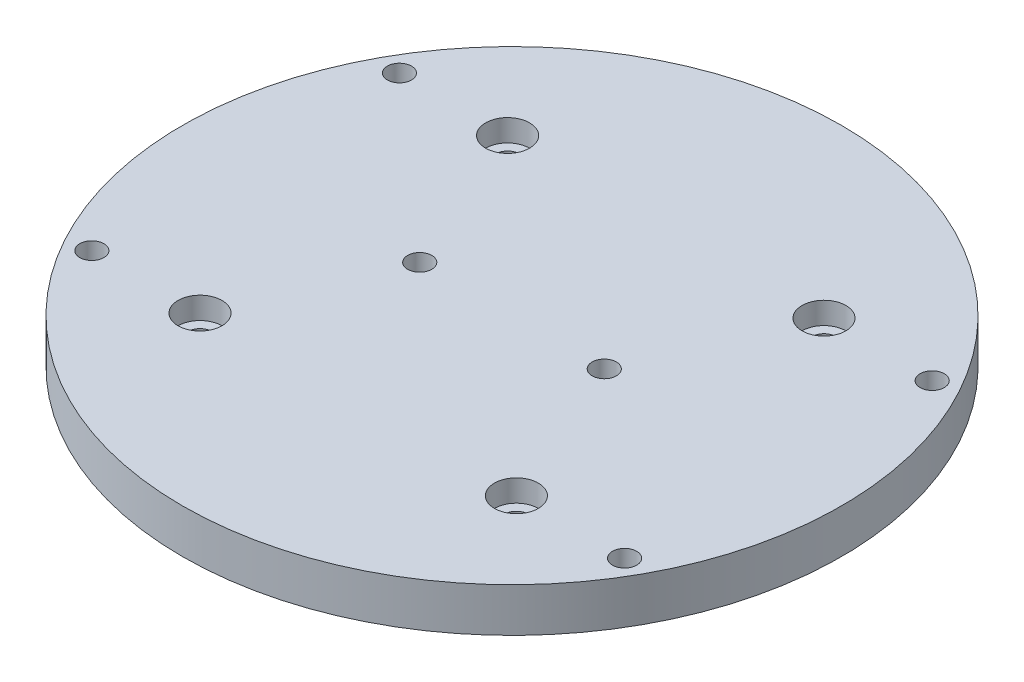
ISO-10303-21;
HEADER;
FILE_DESCRIPTION(('STEP AP214'),'2;1');
FILE_NAME('part.step','',(''),(''),'','','');
FILE_SCHEMA(('AUTOMOTIVE_DESIGN { 1 0 10303 214 1 1 1 1 }'));
ENDSEC;
DATA;
#1=APPLICATION_CONTEXT('core data for automotive mechanical design processes');
#2=APPLICATION_PROTOCOL_DEFINITION('international standard','automotive_design',2000,#1);
#3=PRODUCT_CONTEXT('',#1,'mechanical');
#4=PRODUCT('Part','Part','',(#3));
#5=PRODUCT_RELATED_PRODUCT_CATEGORY('part','',(#4));
#6=PRODUCT_DEFINITION_FORMATION('','',#4);
#7=PRODUCT_DEFINITION_CONTEXT('part definition',#1,'design');
#8=PRODUCT_DEFINITION('design','',#6,#7);
#9=PRODUCT_DEFINITION_SHAPE('','',#8);
#10=(LENGTH_UNIT() NAMED_UNIT(*) SI_UNIT(.MILLI.,.METRE.));
#11=(NAMED_UNIT(*) PLANE_ANGLE_UNIT() SI_UNIT($,.RADIAN.));
#12=(NAMED_UNIT(*) SI_UNIT($,.STERADIAN.) SOLID_ANGLE_UNIT());
#13=UNCERTAINTY_MEASURE_WITH_UNIT(LENGTH_MEASURE(1.E-05),#10,'distance_accuracy_value','');
#14=(GEOMETRIC_REPRESENTATION_CONTEXT(3) GLOBAL_UNCERTAINTY_ASSIGNED_CONTEXT((#13)) GLOBAL_UNIT_ASSIGNED_CONTEXT((#10,
#11,#12)) REPRESENTATION_CONTEXT('',''));
#15=CARTESIAN_POINT('',(0.,0.,0.));
#16=DIRECTION('',(0.,0.,1.));
#17=DIRECTION('',(1.,0.,0.));
#18=AXIS2_PLACEMENT_3D('',#15,#16,#17);
#19=CARTESIAN_POINT('',(36.,-17.,-35.));
#20=DIRECTION('',(0.,1.,0.));
#21=DIRECTION('',(0.,0.,1.));
#22=AXIS2_PLACEMENT_3D('',#19,#20,#21);
#23=CYLINDRICAL_SURFACE('',#22,2.75);
#24=CARTESIAN_POINT('',(36.,0.,-35.));
#25=DIRECTION('',(0.,1.,0.));
#26=DIRECTION('',(0.,0.,1.));
#27=AXIS2_PLACEMENT_3D('',#24,#25,#26);
#28=CIRCLE('',#27,2.75);
#29=CARTESIAN_POINT('',(36.,0.,-32.25));
#30=VERTEX_POINT('',#29);
#31=EDGE_CURVE('E60',#30,#30,#28,.T.);
#32=ORIENTED_EDGE('',*,*,#31,.F.);
#33=EDGE_LOOP('',(#32));
#34=FACE_BOUND('',#33,.T.);
#35=CARTESIAN_POINT('',(36.,5.,-35.));
#36=DIRECTION('',(0.,1.,0.));
#37=DIRECTION('',(0.,0.,1.));
#38=AXIS2_PLACEMENT_3D('',#35,#36,#37);
#39=CIRCLE('',#38,2.75);
#40=CARTESIAN_POINT('',(36.,5.,-32.25));
#41=VERTEX_POINT('',#40);
#42=EDGE_CURVE('E36',#41,#41,#39,.F.);
#43=ORIENTED_EDGE('',*,*,#42,.F.);
#44=EDGE_LOOP('',(#43));
#45=FACE_BOUND('',#44,.T.);
#46=ADVANCED_FACE('F32',(#34,#45),#23,.F.);
#47=CARTESIAN_POINT('',(36.,-17.,35.));
#48=DIRECTION('',(0.,1.,0.));
#49=DIRECTION('',(0.,0.,1.));
#50=AXIS2_PLACEMENT_3D('',#47,#48,#49);
#51=CYLINDRICAL_SURFACE('',#50,2.75);
#52=CARTESIAN_POINT('',(36.,0.,35.));
#53=DIRECTION('',(0.,1.,0.));
#54=DIRECTION('',(0.,0.,1.));
#55=AXIS2_PLACEMENT_3D('',#52,#53,#54);
#56=CIRCLE('',#55,2.75);
#57=CARTESIAN_POINT('',(36.,0.,37.75));
#58=VERTEX_POINT('',#57);
#59=EDGE_CURVE('E63',#58,#58,#56,.T.);
#60=ORIENTED_EDGE('',*,*,#59,.F.);
#61=EDGE_LOOP('',(#60));
#62=FACE_BOUND('',#61,.T.);
#63=CARTESIAN_POINT('',(36.,5.,35.));
#64=DIRECTION('',(0.,1.,0.));
#65=DIRECTION('',(0.,0.,1.));
#66=AXIS2_PLACEMENT_3D('',#63,#64,#65);
#67=CIRCLE('',#66,2.75);
#68=CARTESIAN_POINT('',(36.,5.,37.75));
#69=VERTEX_POINT('',#68);
#70=EDGE_CURVE('E86',#69,#69,#67,.F.);
#71=ORIENTED_EDGE('',*,*,#70,.F.);
#72=EDGE_LOOP('',(#71));
#73=FACE_BOUND('',#72,.T.);
#74=ADVANCED_FACE('F138',(#62,#73),#51,.F.);
#75=CARTESIAN_POINT('',(-36.,-17.,35.));
#76=DIRECTION('',(0.,1.,0.));
#77=DIRECTION('',(0.,0.,1.));
#78=AXIS2_PLACEMENT_3D('',#75,#76,#77);
#79=CYLINDRICAL_SURFACE('',#78,2.75);
#80=CARTESIAN_POINT('',(-36.,0.,35.));
#81=DIRECTION('',(0.,1.,0.));
#82=DIRECTION('',(0.,0.,1.));
#83=AXIS2_PLACEMENT_3D('',#80,#81,#82);
#84=CIRCLE('',#83,2.75);
#85=CARTESIAN_POINT('',(-36.,0.,37.75));
#86=VERTEX_POINT('',#85);
#87=EDGE_CURVE('E66',#86,#86,#84,.T.);
#88=ORIENTED_EDGE('',*,*,#87,.F.);
#89=EDGE_LOOP('',(#88));
#90=FACE_BOUND('',#89,.T.);
#91=CARTESIAN_POINT('',(-36.,5.,35.));
#92=DIRECTION('',(0.,1.,0.));
#93=DIRECTION('',(0.,0.,1.));
#94=AXIS2_PLACEMENT_3D('',#91,#92,#93);
#95=CIRCLE('',#94,2.75);
#96=CARTESIAN_POINT('',(-36.,5.,37.75));
#97=VERTEX_POINT('',#96);
#98=EDGE_CURVE('E83',#97,#97,#95,.F.);
#99=ORIENTED_EDGE('',*,*,#98,.F.);
#100=EDGE_LOOP('',(#99));
#101=FACE_BOUND('',#100,.T.);
#102=ADVANCED_FACE('F145',(#90,#101),#79,.F.);
#103=CARTESIAN_POINT('',(-36.,-17.,-35.));
#104=DIRECTION('',(0.,1.,0.));
#105=DIRECTION('',(0.,0.,1.));
#106=AXIS2_PLACEMENT_3D('',#103,#104,#105);
#107=CYLINDRICAL_SURFACE('',#106,2.75);
#108=CARTESIAN_POINT('',(-36.,0.,-35.));
#109=DIRECTION('',(0.,1.,0.));
#110=DIRECTION('',(0.,0.,1.));
#111=AXIS2_PLACEMENT_3D('',#108,#109,#110);
#112=CIRCLE('',#111,2.75);
#113=CARTESIAN_POINT('',(-36.,0.,-32.25));
#114=VERTEX_POINT('',#113);
#115=EDGE_CURVE('E69',#114,#114,#112,.T.);
#116=ORIENTED_EDGE('',*,*,#115,.F.);
#117=EDGE_LOOP('',(#116));
#118=FACE_BOUND('',#117,.T.);
#119=CARTESIAN_POINT('',(-36.,5.,-35.));
#120=DIRECTION('',(0.,1.,0.));
#121=DIRECTION('',(0.,0.,1.));
#122=AXIS2_PLACEMENT_3D('',#119,#120,#121);
#123=CIRCLE('',#122,2.75);
#124=CARTESIAN_POINT('',(-36.,5.,-32.25));
#125=VERTEX_POINT('',#124);
#126=EDGE_CURVE('E80',#125,#125,#123,.F.);
#127=ORIENTED_EDGE('',*,*,#126,.F.);
#128=EDGE_LOOP('',(#127));
#129=FACE_BOUND('',#128,.T.);
#130=ADVANCED_FACE('F132',(#118,#129),#107,.F.);
#131=CARTESIAN_POINT('',(0.,10.,0.));
#132=DIRECTION('',(0.,-1.,0.));
#133=DIRECTION('',(0.,0.,-1.));
#134=AXIS2_PLACEMENT_3D('',#131,#132,#133);
#135=CYLINDRICAL_SURFACE('',#134,75.);
#136=CARTESIAN_POINT('',(0.,10.,0.));
#137=DIRECTION('',(0.,1.,0.));
#138=DIRECTION('',(0.,0.,1.));
#139=AXIS2_PLACEMENT_3D('',#136,#137,#138);
#140=CIRCLE('',#139,75.);
#141=CARTESIAN_POINT('',(0.,10.,75.));
#142=VERTEX_POINT('',#141);
#143=EDGE_CURVE('E10',#142,#142,#140,.T.);
#144=ORIENTED_EDGE('',*,*,#143,.F.);
#145=EDGE_LOOP('',(#144));
#146=FACE_BOUND('',#145,.T.);
#147=CARTESIAN_POINT('',(0.,0.,0.));
#148=DIRECTION('',(0.,1.,0.));
#149=DIRECTION('',(0.,0.,1.));
#150=AXIS2_PLACEMENT_3D('',#147,#148,#149);
#151=CIRCLE('',#150,75.);
#152=CARTESIAN_POINT('',(0.,0.,75.));
#153=VERTEX_POINT('',#152);
#154=EDGE_CURVE('E40',#153,#153,#151,.T.);
#155=ORIENTED_EDGE('',*,*,#154,.T.);
#156=EDGE_LOOP('',(#155));
#157=FACE_BOUND('',#156,.T.);
#158=ADVANCED_FACE('F34',(#146,#157),#135,.T.);
#159=CARTESIAN_POINT('',(0.,10.,0.));
#160=DIRECTION('',(0.,1.,0.));
#161=DIRECTION('',(0.,0.,1.));
#162=AXIS2_PLACEMENT_3D('',#159,#160,#161);
#163=PLANE('',#162);
#164=CARTESIAN_POINT('',(-36.,10.,-35.));
#165=DIRECTION('',(0.,1.,0.));
#166=DIRECTION('',(0.,0.,1.));
#167=AXIS2_PLACEMENT_3D('',#164,#165,#166);
#168=CIRCLE('',#167,5.);
#169=CARTESIAN_POINT('',(-36.,10.,-30.));
#170=VERTEX_POINT('',#169);
#171=EDGE_CURVE('E250',#170,#170,#168,.T.);
#172=ORIENTED_EDGE('',*,*,#171,.F.);
#173=EDGE_LOOP('',(#172));
#174=FACE_BOUND('',#173,.T.);
#175=CARTESIAN_POINT('',(-36.,10.,35.));
#176=DIRECTION('',(0.,1.,0.));
#177=DIRECTION('',(0.,0.,1.));
#178=AXIS2_PLACEMENT_3D('',#175,#176,#177);
#179=CIRCLE('',#178,5.);
#180=CARTESIAN_POINT('',(-36.,10.,39.9999999999999));
#181=VERTEX_POINT('',#180);
#182=EDGE_CURVE('E256',#181,#181,#179,.T.);
#183=ORIENTED_EDGE('',*,*,#182,.F.);
#184=EDGE_LOOP('',(#183));
#185=FACE_BOUND('',#184,.T.);
#186=CARTESIAN_POINT('',(36.,10.,35.));
#187=DIRECTION('',(0.,1.,0.));
#188=DIRECTION('',(0.,0.,1.));
#189=AXIS2_PLACEMENT_3D('',#186,#187,#188);
#190=CIRCLE('',#189,5.);
#191=CARTESIAN_POINT('',(36.,10.,40.));
#192=VERTEX_POINT('',#191);
#193=EDGE_CURVE('E261',#192,#192,#190,.T.);
#194=ORIENTED_EDGE('',*,*,#193,.F.);
#195=EDGE_LOOP('',(#194));
#196=FACE_BOUND('',#195,.T.);
#197=CARTESIAN_POINT('',(36.,10.,-35.));
#198=DIRECTION('',(0.,1.,0.));
#199=DIRECTION('',(0.,0.,1.));
#200=AXIS2_PLACEMENT_3D('',#197,#198,#199);
#201=CIRCLE('',#200,5.);
#202=CARTESIAN_POINT('',(36.,10.,-30.));
#203=VERTEX_POINT('',#202);
#204=EDGE_CURVE('E104',#203,#203,#201,.T.);
#205=ORIENTED_EDGE('',*,*,#204,.F.);
#206=EDGE_LOOP('',(#205));
#207=FACE_BOUND('',#206,.T.);
#208=CARTESIAN_POINT('',(-60.6217782649107,10.,35.));
#209=DIRECTION('',(0.,1.,0.));
#210=DIRECTION('',(0.,0.,1.));
#211=AXIS2_PLACEMENT_3D('',#208,#209,#210);
#212=CIRCLE('',#211,2.75);
#213=CARTESIAN_POINT('',(-60.6217782649107,10.,37.75));
#214=VERTEX_POINT('',#213);
#215=EDGE_CURVE('E95',#214,#214,#212,.T.);
#216=ORIENTED_EDGE('',*,*,#215,.F.);
#217=EDGE_LOOP('',(#216));
#218=FACE_BOUND('',#217,.T.);
#219=CARTESIAN_POINT('',(60.6217782649107,10.,35.0000000000001));
#220=DIRECTION('',(0.,1.,0.));
#221=DIRECTION('',(0.,0.,-1.));
#222=AXIS2_PLACEMENT_3D('',#219,#220,#221);
#223=CIRCLE('',#222,2.75);
#224=CARTESIAN_POINT('',(60.6217782649107,10.,32.2500000000001));
#225=VERTEX_POINT('',#224);
#226=EDGE_CURVE('E100',#225,#225,#223,.T.);
#227=ORIENTED_EDGE('',*,*,#226,.F.);
#228=EDGE_LOOP('',(#227));
#229=FACE_BOUND('',#228,.T.);
#230=CARTESIAN_POINT('',(60.6217782649107,10.,-35.0000000000001));
#231=DIRECTION('',(0.,1.,0.));
#232=DIRECTION('',(0.,0.,1.));
#233=AXIS2_PLACEMENT_3D('',#230,#231,#232);
#234=CIRCLE('',#233,2.75);
#235=CARTESIAN_POINT('',(60.6217782649107,10.,-32.2500000000001));
#236=VERTEX_POINT('',#235);
#237=EDGE_CURVE('E106',#236,#236,#234,.T.);
#238=ORIENTED_EDGE('',*,*,#237,.F.);
#239=EDGE_LOOP('',(#238));
#240=FACE_BOUND('',#239,.T.);
#241=CARTESIAN_POINT('',(-21.,10.,0.));
#242=DIRECTION('',(0.,1.,0.));
#243=DIRECTION('',(0.,0.,1.));
#244=AXIS2_PLACEMENT_3D('',#241,#242,#243);
#245=CIRCLE('',#244,2.75);
#246=CARTESIAN_POINT('',(-21.,10.,2.75));
#247=VERTEX_POINT('',#246);
#248=EDGE_CURVE('E109',#247,#247,#245,.T.);
#249=ORIENTED_EDGE('',*,*,#248,.F.);
#250=EDGE_LOOP('',(#249));
#251=FACE_BOUND('',#250,.T.);
#252=CARTESIAN_POINT('',(-60.6217782649107,10.,-35.0000000000001));
#253=DIRECTION('',(0.,1.,0.));
#254=DIRECTION('',(0.,0.,-1.));
#255=AXIS2_PLACEMENT_3D('',#252,#253,#254);
#256=CIRCLE('',#255,2.75);
#257=CARTESIAN_POINT('',(-60.6217782649107,10.,-37.7500000000001));
#258=VERTEX_POINT('',#257);
#259=EDGE_CURVE('E91',#258,#258,#256,.T.);
#260=ORIENTED_EDGE('',*,*,#259,.F.);
#261=EDGE_LOOP('',(#260));
#262=FACE_BOUND('',#261,.T.);
#263=CARTESIAN_POINT('',(21.,10.,0.));
#264=DIRECTION('',(0.,1.,0.));
#265=DIRECTION('',(0.,0.,1.));
#266=AXIS2_PLACEMENT_3D('',#263,#264,#265);
#267=CIRCLE('',#266,2.75);
#268=CARTESIAN_POINT('',(21.,10.,2.74999999999999));
#269=VERTEX_POINT('',#268);
#270=EDGE_CURVE('E48',#269,#269,#267,.T.);
#271=ORIENTED_EDGE('',*,*,#270,.F.);
#272=EDGE_LOOP('',(#271));
#273=FACE_BOUND('',#272,.T.);
#274=ORIENTED_EDGE('',*,*,#143,.T.);
#275=EDGE_LOOP('',(#274));
#276=FACE_BOUND('',#275,.T.);
#277=ADVANCED_FACE('F120',(#174,#185,#196,#207,#218,#229,#240,#251,#262,#273,#276),#163,.T.);
#278=CARTESIAN_POINT('',(0.,0.,0.));
#279=DIRECTION('',(0.,1.,0.));
#280=DIRECTION('',(0.,0.,1.));
#281=AXIS2_PLACEMENT_3D('',#278,#279,#280);
#282=PLANE('',#281);
#283=CARTESIAN_POINT('',(-60.6217782649107,0.,35.));
#284=DIRECTION('',(0.,1.,0.));
#285=DIRECTION('',(0.,0.,1.));
#286=AXIS2_PLACEMENT_3D('',#283,#284,#285);
#287=CIRCLE('',#286,2.75);
#288=CARTESIAN_POINT('',(-60.6217782649107,0.,37.75));
#289=VERTEX_POINT('',#288);
#290=EDGE_CURVE('E45',#289,#289,#287,.T.);
#291=ORIENTED_EDGE('',*,*,#290,.T.);
#292=EDGE_LOOP('',(#291));
#293=FACE_BOUND('',#292,.T.);
#294=CARTESIAN_POINT('',(60.6217782649107,0.,35.0000000000001));
#295=DIRECTION('',(0.,1.,0.));
#296=DIRECTION('',(0.,0.,1.));
#297=AXIS2_PLACEMENT_3D('',#294,#295,#296);
#298=CIRCLE('',#297,2.75);
#299=CARTESIAN_POINT('',(60.6217782649107,0.,37.7500000000001));
#300=VERTEX_POINT('',#299);
#301=EDGE_CURVE('E75',#300,#300,#298,.T.);
#302=ORIENTED_EDGE('',*,*,#301,.T.);
#303=EDGE_LOOP('',(#302));
#304=FACE_BOUND('',#303,.T.);
#305=CARTESIAN_POINT('',(60.6217782649107,0.,-35.0000000000001));
#306=DIRECTION('',(0.,1.,0.));
#307=DIRECTION('',(0.,0.,1.));
#308=AXIS2_PLACEMENT_3D('',#305,#306,#307);
#309=CIRCLE('',#308,2.75);
#310=CARTESIAN_POINT('',(60.6217782649107,0.,-32.2500000000001));
#311=VERTEX_POINT('',#310);
#312=EDGE_CURVE('E72',#311,#311,#309,.T.);
#313=ORIENTED_EDGE('',*,*,#312,.T.);
#314=EDGE_LOOP('',(#313));
#315=FACE_BOUND('',#314,.T.);
#316=ORIENTED_EDGE('',*,*,#115,.T.);
#317=EDGE_LOOP('',(#316));
#318=FACE_BOUND('',#317,.T.);
#319=ORIENTED_EDGE('',*,*,#87,.T.);
#320=EDGE_LOOP('',(#319));
#321=FACE_BOUND('',#320,.T.);
#322=ORIENTED_EDGE('',*,*,#59,.T.);
#323=EDGE_LOOP('',(#322));
#324=FACE_BOUND('',#323,.T.);
#325=ORIENTED_EDGE('',*,*,#31,.T.);
#326=EDGE_LOOP('',(#325));
#327=FACE_BOUND('',#326,.T.);
#328=CARTESIAN_POINT('',(-21.,0.,0.));
#329=DIRECTION('',(0.,1.,0.));
#330=DIRECTION('',(0.,0.,1.));
#331=AXIS2_PLACEMENT_3D('',#328,#329,#330);
#332=CIRCLE('',#331,2.75);
#333=CARTESIAN_POINT('',(-21.,0.,2.75));
#334=VERTEX_POINT('',#333);
#335=EDGE_CURVE('E57',#334,#334,#332,.T.);
#336=ORIENTED_EDGE('',*,*,#335,.T.);
#337=EDGE_LOOP('',(#336));
#338=FACE_BOUND('',#337,.T.);
#339=CARTESIAN_POINT('',(-60.6217782649107,0.,-35.0000000000001));
#340=DIRECTION('',(0.,1.,0.));
#341=DIRECTION('',(0.,0.,1.));
#342=AXIS2_PLACEMENT_3D('',#339,#340,#341);
#343=CIRCLE('',#342,2.75);
#344=CARTESIAN_POINT('',(-60.6217782649107,0.,-32.2500000000001));
#345=VERTEX_POINT('',#344);
#346=EDGE_CURVE('E54',#345,#345,#343,.T.);
#347=ORIENTED_EDGE('',*,*,#346,.T.);
#348=EDGE_LOOP('',(#347));
#349=FACE_BOUND('',#348,.T.);
#350=CARTESIAN_POINT('',(21.,0.,0.));
#351=DIRECTION('',(0.,1.,0.));
#352=DIRECTION('',(0.,0.,1.));
#353=AXIS2_PLACEMENT_3D('',#350,#351,#352);
#354=CIRCLE('',#353,2.75);
#355=CARTESIAN_POINT('',(21.,0.,2.74999999999999));
#356=VERTEX_POINT('',#355);
#357=EDGE_CURVE('E51',#356,#356,#354,.T.);
#358=ORIENTED_EDGE('',*,*,#357,.T.);
#359=EDGE_LOOP('',(#358));
#360=FACE_BOUND('',#359,.T.);
#361=ORIENTED_EDGE('',*,*,#154,.F.);
#362=EDGE_LOOP('',(#361));
#363=FACE_BOUND('',#362,.T.);
#364=ADVANCED_FACE('F122',(#293,#304,#315,#318,#321,#324,#327,#338,#349,#360,#363),#282,.F.);
#365=CARTESIAN_POINT('',(21.,-17.,0.));
#366=DIRECTION('',(0.,1.,0.));
#367=DIRECTION('',(0.,0.,1.));
#368=AXIS2_PLACEMENT_3D('',#365,#366,#367);
#369=CYLINDRICAL_SURFACE('',#368,2.75);
#370=ORIENTED_EDGE('',*,*,#270,.T.);
#371=EDGE_LOOP('',(#370));
#372=FACE_BOUND('',#371,.T.);
#373=ORIENTED_EDGE('',*,*,#357,.F.);
#374=EDGE_LOOP('',(#373));
#375=FACE_BOUND('',#374,.T.);
#376=ADVANCED_FACE('F117',(#372,#375),#369,.F.);
#377=CARTESIAN_POINT('',(-60.6217782649107,-17.,-35.0000000000001));
#378=DIRECTION('',(0.,1.,0.));
#379=DIRECTION('',(0.,0.,1.));
#380=AXIS2_PLACEMENT_3D('',#377,#378,#379);
#381=CYLINDRICAL_SURFACE('',#380,2.75);
#382=ORIENTED_EDGE('',*,*,#259,.T.);
#383=EDGE_LOOP('',(#382));
#384=FACE_BOUND('',#383,.T.);
#385=ORIENTED_EDGE('',*,*,#346,.F.);
#386=EDGE_LOOP('',(#385));
#387=FACE_BOUND('',#386,.T.);
#388=ADVANCED_FACE('F157',(#384,#387),#381,.F.);
#389=CARTESIAN_POINT('',(-21.,-17.,0.));
#390=DIRECTION('',(0.,1.,0.));
#391=DIRECTION('',(0.,0.,1.));
#392=AXIS2_PLACEMENT_3D('',#389,#390,#391);
#393=CYLINDRICAL_SURFACE('',#392,2.75);
#394=ORIENTED_EDGE('',*,*,#248,.T.);
#395=EDGE_LOOP('',(#394));
#396=FACE_BOUND('',#395,.T.);
#397=ORIENTED_EDGE('',*,*,#335,.F.);
#398=EDGE_LOOP('',(#397));
#399=FACE_BOUND('',#398,.T.);
#400=ADVANCED_FACE('F151',(#396,#399),#393,.F.);
#401=CARTESIAN_POINT('',(60.6217782649107,-17.,-35.0000000000001));
#402=DIRECTION('',(0.,1.,0.));
#403=DIRECTION('',(0.,0.,1.));
#404=AXIS2_PLACEMENT_3D('',#401,#402,#403);
#405=CYLINDRICAL_SURFACE('',#404,2.75);
#406=ORIENTED_EDGE('',*,*,#237,.T.);
#407=EDGE_LOOP('',(#406));
#408=FACE_BOUND('',#407,.T.);
#409=ORIENTED_EDGE('',*,*,#312,.F.);
#410=EDGE_LOOP('',(#409));
#411=FACE_BOUND('',#410,.T.);
#412=ADVANCED_FACE('F166',(#408,#411),#405,.F.);
#413=CARTESIAN_POINT('',(60.6217782649107,-17.,35.0000000000001));
#414=DIRECTION('',(0.,1.,0.));
#415=DIRECTION('',(0.,0.,1.));
#416=AXIS2_PLACEMENT_3D('',#413,#414,#415);
#417=CYLINDRICAL_SURFACE('',#416,2.75);
#418=ORIENTED_EDGE('',*,*,#226,.T.);
#419=EDGE_LOOP('',(#418));
#420=FACE_BOUND('',#419,.T.);
#421=ORIENTED_EDGE('',*,*,#301,.F.);
#422=EDGE_LOOP('',(#421));
#423=FACE_BOUND('',#422,.T.);
#424=ADVANCED_FACE('F176',(#420,#423),#417,.F.);
#425=CARTESIAN_POINT('',(-60.6217782649107,-17.,35.));
#426=DIRECTION('',(0.,1.,0.));
#427=DIRECTION('',(0.,0.,1.));
#428=AXIS2_PLACEMENT_3D('',#425,#426,#427);
#429=CYLINDRICAL_SURFACE('',#428,2.75);
#430=ORIENTED_EDGE('',*,*,#215,.T.);
#431=EDGE_LOOP('',(#430));
#432=FACE_BOUND('',#431,.T.);
#433=ORIENTED_EDGE('',*,*,#290,.F.);
#434=EDGE_LOOP('',(#433));
#435=FACE_BOUND('',#434,.T.);
#436=ADVANCED_FACE('F179',(#432,#435),#429,.F.);
#437=CARTESIAN_POINT('',(-36.,5.,-35.));
#438=DIRECTION('',(0.,1.,0.));
#439=DIRECTION('',(0.,0.,1.));
#440=AXIS2_PLACEMENT_3D('',#437,#438,#439);
#441=PLANE('',#440);
#442=CARTESIAN_POINT('',(-36.,5.,-35.));
#443=DIRECTION('',(0.,1.,0.));
#444=DIRECTION('',(0.,0.,1.));
#445=AXIS2_PLACEMENT_3D('',#442,#443,#444);
#446=CIRCLE('',#445,5.);
#447=CARTESIAN_POINT('',(-36.,5.,-30.));
#448=VERTEX_POINT('',#447);
#449=EDGE_CURVE('E253',#448,#448,#446,.T.);
#450=ORIENTED_EDGE('',*,*,#449,.T.);
#451=EDGE_LOOP('',(#450));
#452=FACE_BOUND('',#451,.T.);
#453=ORIENTED_EDGE('',*,*,#126,.T.);
#454=EDGE_LOOP('',(#453));
#455=FACE_BOUND('',#454,.T.);
#456=ADVANCED_FACE('F182',(#452,#455),#441,.T.);
#457=CARTESIAN_POINT('',(-36.,5.,-35.));
#458=DIRECTION('',(0.,1.,0.));
#459=DIRECTION('',(0.,0.,1.));
#460=AXIS2_PLACEMENT_3D('',#457,#458,#459);
#461=CYLINDRICAL_SURFACE('',#460,5.);
#462=ORIENTED_EDGE('',*,*,#449,.F.);
#463=EDGE_LOOP('',(#462));
#464=FACE_BOUND('',#463,.T.);
#465=ORIENTED_EDGE('',*,*,#171,.T.);
#466=EDGE_LOOP('',(#465));
#467=FACE_BOUND('',#466,.T.);
#468=ADVANCED_FACE('F187',(#464,#467),#461,.F.);
#469=CARTESIAN_POINT('',(-36.,5.,35.));
#470=DIRECTION('',(0.,1.,0.));
#471=DIRECTION('',(0.,0.,1.));
#472=AXIS2_PLACEMENT_3D('',#469,#470,#471);
#473=PLANE('',#472);
#474=CARTESIAN_POINT('',(-36.,5.,35.));
#475=DIRECTION('',(0.,1.,0.));
#476=DIRECTION('',(0.,0.,1.));
#477=AXIS2_PLACEMENT_3D('',#474,#475,#476);
#478=CIRCLE('',#477,5.);
#479=CARTESIAN_POINT('',(-36.,5.,39.9999999999999));
#480=VERTEX_POINT('',#479);
#481=EDGE_CURVE('E259',#480,#480,#478,.T.);
#482=ORIENTED_EDGE('',*,*,#481,.T.);
#483=EDGE_LOOP('',(#482));
#484=FACE_BOUND('',#483,.T.);
#485=ORIENTED_EDGE('',*,*,#98,.T.);
#486=EDGE_LOOP('',(#485));
#487=FACE_BOUND('',#486,.T.);
#488=ADVANCED_FACE('F218',(#484,#487),#473,.T.);
#489=CARTESIAN_POINT('',(-36.,5.,35.));
#490=DIRECTION('',(0.,1.,0.));
#491=DIRECTION('',(0.,0.,1.));
#492=AXIS2_PLACEMENT_3D('',#489,#490,#491);
#493=CYLINDRICAL_SURFACE('',#492,5.);
#494=ORIENTED_EDGE('',*,*,#481,.F.);
#495=EDGE_LOOP('',(#494));
#496=FACE_BOUND('',#495,.T.);
#497=ORIENTED_EDGE('',*,*,#182,.T.);
#498=EDGE_LOOP('',(#497));
#499=FACE_BOUND('',#498,.T.);
#500=ADVANCED_FACE('F220',(#496,#499),#493,.F.);
#501=CARTESIAN_POINT('',(36.,5.,35.));
#502=DIRECTION('',(0.,1.,0.));
#503=DIRECTION('',(0.,0.,1.));
#504=AXIS2_PLACEMENT_3D('',#501,#502,#503);
#505=PLANE('',#504);
#506=CARTESIAN_POINT('',(36.,5.,35.));
#507=DIRECTION('',(0.,1.,0.));
#508=DIRECTION('',(0.,0.,1.));
#509=AXIS2_PLACEMENT_3D('',#506,#507,#508);
#510=CIRCLE('',#509,5.);
#511=CARTESIAN_POINT('',(36.,5.,40.));
#512=VERTEX_POINT('',#511);
#513=EDGE_CURVE('E248',#512,#512,#510,.T.);
#514=ORIENTED_EDGE('',*,*,#513,.T.);
#515=EDGE_LOOP('',(#514));
#516=FACE_BOUND('',#515,.T.);
#517=ORIENTED_EDGE('',*,*,#70,.T.);
#518=EDGE_LOOP('',(#517));
#519=FACE_BOUND('',#518,.T.);
#520=ADVANCED_FACE('F227',(#516,#519),#505,.T.);
#521=CARTESIAN_POINT('',(36.,5.,35.));
#522=DIRECTION('',(0.,1.,0.));
#523=DIRECTION('',(0.,0.,1.));
#524=AXIS2_PLACEMENT_3D('',#521,#522,#523);
#525=CYLINDRICAL_SURFACE('',#524,5.);
#526=ORIENTED_EDGE('',*,*,#513,.F.);
#527=EDGE_LOOP('',(#526));
#528=FACE_BOUND('',#527,.T.);
#529=ORIENTED_EDGE('',*,*,#193,.T.);
#530=EDGE_LOOP('',(#529));
#531=FACE_BOUND('',#530,.T.);
#532=ADVANCED_FACE('F234',(#528,#531),#525,.F.);
#533=CARTESIAN_POINT('',(36.,5.,-35.));
#534=DIRECTION('',(0.,1.,0.));
#535=DIRECTION('',(0.,0.,1.));
#536=AXIS2_PLACEMENT_3D('',#533,#534,#535);
#537=PLANE('',#536);
#538=CARTESIAN_POINT('',(36.,5.,-35.));
#539=DIRECTION('',(0.,1.,0.));
#540=DIRECTION('',(0.,0.,1.));
#541=AXIS2_PLACEMENT_3D('',#538,#539,#540);
#542=CIRCLE('',#541,5.);
#543=CARTESIAN_POINT('',(36.,5.,-30.));
#544=VERTEX_POINT('',#543);
#545=EDGE_CURVE('E84',#544,#544,#542,.T.);
#546=ORIENTED_EDGE('',*,*,#545,.T.);
#547=EDGE_LOOP('',(#546));
#548=FACE_BOUND('',#547,.T.);
#549=ORIENTED_EDGE('',*,*,#42,.T.);
#550=EDGE_LOOP('',(#549));
#551=FACE_BOUND('',#550,.T.);
#552=ADVANCED_FACE('F236',(#548,#551),#537,.T.);
#553=CARTESIAN_POINT('',(36.,5.,-35.));
#554=DIRECTION('',(0.,1.,0.));
#555=DIRECTION('',(0.,0.,1.));
#556=AXIS2_PLACEMENT_3D('',#553,#554,#555);
#557=CYLINDRICAL_SURFACE('',#556,5.);
#558=ORIENTED_EDGE('',*,*,#545,.F.);
#559=EDGE_LOOP('',(#558));
#560=FACE_BOUND('',#559,.T.);
#561=ORIENTED_EDGE('',*,*,#204,.T.);
#562=EDGE_LOOP('',(#561));
#563=FACE_BOUND('',#562,.T.);
#564=ADVANCED_FACE('F170',(#560,#563),#557,.F.);
#565=CLOSED_SHELL('',(#46,#74,#102,#130,#158,#277,#364,#376,#388,#400,#412,#424,#436,#456,#468,
#488,#500,#520,#532,#552,#564));
#566=MANIFOLD_SOLID_BREP('B2',#565);
#567=ADVANCED_BREP_SHAPE_REPRESENTATION('',(#18,#566),#14);
#568=SHAPE_DEFINITION_REPRESENTATION(#9,#567);
ENDSEC;
END-ISO-10303-21;
